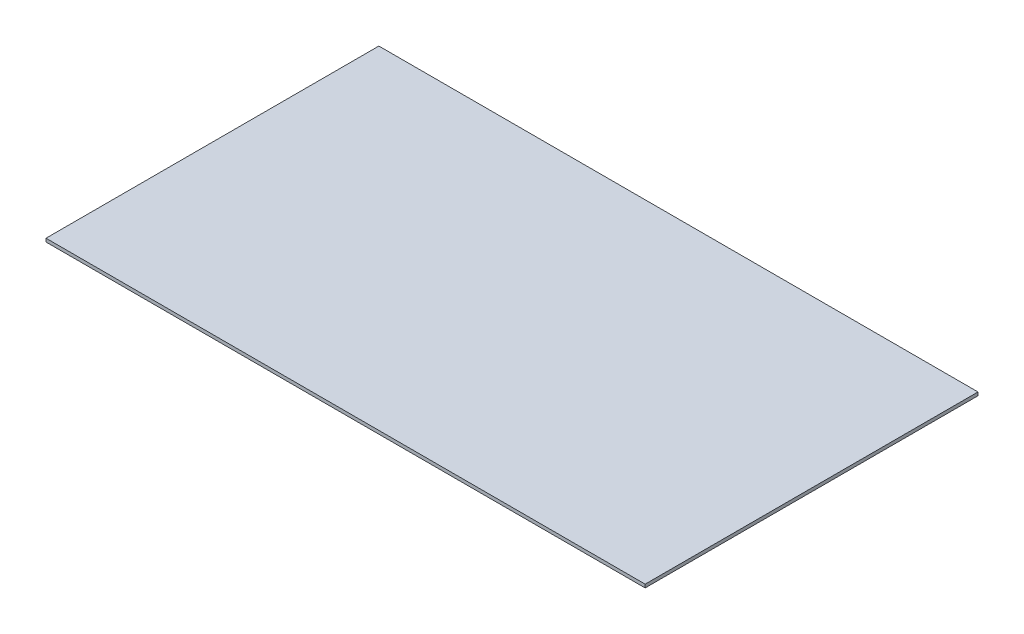
ISO-10303-21;
HEADER;
FILE_DESCRIPTION(('STEP AP214'),'2;1');
FILE_NAME('part.step','',(''),(''),'','','');
FILE_SCHEMA(('AUTOMOTIVE_DESIGN { 1 0 10303 214 1 1 1 1 }'));
ENDSEC;
DATA;
#1=APPLICATION_CONTEXT('core data for automotive mechanical design processes');
#2=APPLICATION_PROTOCOL_DEFINITION('international standard','automotive_design',2000,#1);
#3=PRODUCT_CONTEXT('',#1,'mechanical');
#4=PRODUCT('Part','Part','',(#3));
#5=PRODUCT_RELATED_PRODUCT_CATEGORY('part','',(#4));
#6=PRODUCT_DEFINITION_FORMATION('','',#4);
#7=PRODUCT_DEFINITION_CONTEXT('part definition',#1,'design');
#8=PRODUCT_DEFINITION('design','',#6,#7);
#9=PRODUCT_DEFINITION_SHAPE('','',#8);
#10=(LENGTH_UNIT() NAMED_UNIT(*) SI_UNIT(.MILLI.,.METRE.));
#11=(NAMED_UNIT(*) PLANE_ANGLE_UNIT() SI_UNIT($,.RADIAN.));
#12=(NAMED_UNIT(*) SI_UNIT($,.STERADIAN.) SOLID_ANGLE_UNIT());
#13=UNCERTAINTY_MEASURE_WITH_UNIT(LENGTH_MEASURE(1.E-05),#10,'distance_accuracy_value','');
#14=(GEOMETRIC_REPRESENTATION_CONTEXT(3) GLOBAL_UNCERTAINTY_ASSIGNED_CONTEXT((#13)) GLOBAL_UNIT_ASSIGNED_CONTEXT((#10,
#11,#12)) REPRESENTATION_CONTEXT('',''));
#15=CARTESIAN_POINT('',(0.,0.,0.));
#16=DIRECTION('',(0.,0.,1.));
#17=DIRECTION('',(1.,0.,0.));
#18=AXIS2_PLACEMENT_3D('',#15,#16,#17);
#19=CARTESIAN_POINT('',(-18.,10.,0.));
#20=DIRECTION('',(-1.,0.,0.));
#21=DIRECTION('',(0.,0.,-1.));
#22=AXIS2_PLACEMENT_3D('',#19,#20,#21);
#23=PLANE('',#22);
#24=DIRECTION('',(0.,1.,0.));
#25=VECTOR('',#24,1.);
#26=CARTESIAN_POINT('',(-18.,10.,27.));
#27=LINE('',#26,#25);
#28=CARTESIAN_POINT('',(-18.,10.,27.));
#29=VERTEX_POINT('',#28);
#30=CARTESIAN_POINT('',(-18.,10.2,27.));
#31=VERTEX_POINT('',#30);
#32=EDGE_CURVE('E11',#29,#31,#27,.T.);
#33=ORIENTED_EDGE('',*,*,#32,.F.);
#34=DIRECTION('',(0.,0.,-1.));
#35=VECTOR('',#34,1.);
#36=CARTESIAN_POINT('',(-18.,10.,0.));
#37=LINE('',#36,#35);
#38=CARTESIAN_POINT('',(-18.,10.,47.));
#39=VERTEX_POINT('',#38);
#40=EDGE_CURVE('E88',#29,#39,#37,.F.);
#41=ORIENTED_EDGE('',*,*,#40,.T.);
#42=DIRECTION('',(0.,1.,0.));
#43=VECTOR('',#42,1.);
#44=CARTESIAN_POINT('',(-18.,10.,47.));
#45=LINE('',#44,#43);
#46=CARTESIAN_POINT('',(-18.,10.2,47.));
#47=VERTEX_POINT('',#46);
#48=EDGE_CURVE('E43',#39,#47,#45,.T.);
#49=ORIENTED_EDGE('',*,*,#48,.T.);
#50=DIRECTION('',(0.,0.,-1.));
#51=VECTOR('',#50,1.);
#52=CARTESIAN_POINT('',(-18.,10.2,0.));
#53=LINE('',#52,#51);
#54=EDGE_CURVE('E101',#31,#47,#53,.F.);
#55=ORIENTED_EDGE('',*,*,#54,.F.);
#56=EDGE_LOOP('',(#33,#41,#49,#55));
#57=FACE_BOUND('',#56,.T.);
#58=ADVANCED_FACE('F33',(#57),#23,.T.);
#59=CARTESIAN_POINT('',(0.,10.,47.));
#60=DIRECTION('',(0.,0.,-1.));
#61=DIRECTION('',(1.,0.,0.));
#62=AXIS2_PLACEMENT_3D('',#59,#60,#61);
#63=PLANE('',#62);
#64=ORIENTED_EDGE('',*,*,#48,.F.);
#65=DIRECTION('',(1.,0.,0.));
#66=VECTOR('',#65,1.);
#67=CARTESIAN_POINT('',(0.,10.,47.));
#68=LINE('',#67,#66);
#69=CARTESIAN_POINT('',(18.,10.,47.));
#70=VERTEX_POINT('',#69);
#71=EDGE_CURVE('E95',#39,#70,#68,.T.);
#72=ORIENTED_EDGE('',*,*,#71,.T.);
#73=DIRECTION('',(0.,1.,0.));
#74=VECTOR('',#73,1.);
#75=CARTESIAN_POINT('',(18.,10.,47.));
#76=LINE('',#75,#74);
#77=CARTESIAN_POINT('',(18.,10.2,47.));
#78=VERTEX_POINT('',#77);
#79=EDGE_CURVE('E51',#70,#78,#76,.T.);
#80=ORIENTED_EDGE('',*,*,#79,.T.);
#81=DIRECTION('',(1.,0.,0.));
#82=VECTOR('',#81,1.);
#83=CARTESIAN_POINT('',(0.,10.2,47.));
#84=LINE('',#83,#82);
#85=EDGE_CURVE('E82',#47,#78,#84,.T.);
#86=ORIENTED_EDGE('',*,*,#85,.F.);
#87=EDGE_LOOP('',(#64,#72,#80,#86));
#88=FACE_BOUND('',#87,.T.);
#89=ADVANCED_FACE('F105',(#88),#63,.F.);
#90=CARTESIAN_POINT('',(18.,10.,0.));
#91=DIRECTION('',(-1.,0.,0.));
#92=DIRECTION('',(0.,0.,-1.));
#93=AXIS2_PLACEMENT_3D('',#90,#91,#92);
#94=PLANE('',#93);
#95=ORIENTED_EDGE('',*,*,#79,.F.);
#96=DIRECTION('',(0.,0.,-1.));
#97=VECTOR('',#96,1.);
#98=CARTESIAN_POINT('',(18.,10.,0.));
#99=LINE('',#98,#97);
#100=CARTESIAN_POINT('',(18.,10.,27.));
#101=VERTEX_POINT('',#100);
#102=EDGE_CURVE('E87',#101,#70,#99,.F.);
#103=ORIENTED_EDGE('',*,*,#102,.F.);
#104=DIRECTION('',(0.,1.,0.));
#105=VECTOR('',#104,1.);
#106=CARTESIAN_POINT('',(18.,10.,27.));
#107=LINE('',#106,#105);
#108=CARTESIAN_POINT('',(18.,10.2,27.));
#109=VERTEX_POINT('',#108);
#110=EDGE_CURVE('E37',#101,#109,#107,.T.);
#111=ORIENTED_EDGE('',*,*,#110,.T.);
#112=DIRECTION('',(0.,0.,-1.));
#113=VECTOR('',#112,1.);
#114=CARTESIAN_POINT('',(18.,10.2,0.));
#115=LINE('',#114,#113);
#116=EDGE_CURVE('E97',#109,#78,#115,.F.);
#117=ORIENTED_EDGE('',*,*,#116,.T.);
#118=EDGE_LOOP('',(#95,#103,#111,#117));
#119=FACE_BOUND('',#118,.T.);
#120=ADVANCED_FACE('F90',(#119),#94,.F.);
#121=CARTESIAN_POINT('',(0.,10.,27.));
#122=DIRECTION('',(0.,0.,-1.));
#123=DIRECTION('',(1.,0.,0.));
#124=AXIS2_PLACEMENT_3D('',#121,#122,#123);
#125=PLANE('',#124);
#126=DIRECTION('',(1.,0.,0.));
#127=VECTOR('',#126,1.);
#128=CARTESIAN_POINT('',(0.,10.,27.));
#129=LINE('',#128,#127);
#130=EDGE_CURVE('E76',#101,#29,#129,.F.);
#131=ORIENTED_EDGE('',*,*,#130,.T.);
#132=ORIENTED_EDGE('',*,*,#32,.T.);
#133=DIRECTION('',(1.,0.,0.));
#134=VECTOR('',#133,1.);
#135=CARTESIAN_POINT('',(0.,10.2,27.));
#136=LINE('',#135,#134);
#137=EDGE_CURVE('E78',#109,#31,#136,.F.);
#138=ORIENTED_EDGE('',*,*,#137,.F.);
#139=ORIENTED_EDGE('',*,*,#110,.F.);
#140=EDGE_LOOP('',(#131,#132,#138,#139));
#141=FACE_BOUND('',#140,.T.);
#142=ADVANCED_FACE('F35',(#141),#125,.T.);
#143=CARTESIAN_POINT('',(0.,10.2,0.));
#144=DIRECTION('',(0.,-1.,0.));
#145=DIRECTION('',(0.,0.,-1.));
#146=AXIS2_PLACEMENT_3D('',#143,#144,#145);
#147=PLANE('',#146);
#148=ORIENTED_EDGE('',*,*,#116,.F.);
#149=ORIENTED_EDGE('',*,*,#137,.T.);
#150=ORIENTED_EDGE('',*,*,#54,.T.);
#151=ORIENTED_EDGE('',*,*,#85,.T.);
#152=EDGE_LOOP('',(#148,#149,#150,#151));
#153=FACE_BOUND('',#152,.T.);
#154=ADVANCED_FACE('F104',(#153),#147,.F.);
#155=CARTESIAN_POINT('',(0.,10.,0.));
#156=DIRECTION('',(0.,-1.,0.));
#157=DIRECTION('',(0.,0.,-1.));
#158=AXIS2_PLACEMENT_3D('',#155,#156,#157);
#159=PLANE('',#158);
#160=ORIENTED_EDGE('',*,*,#102,.T.);
#161=ORIENTED_EDGE('',*,*,#71,.F.);
#162=ORIENTED_EDGE('',*,*,#40,.F.);
#163=ORIENTED_EDGE('',*,*,#130,.F.);
#164=EDGE_LOOP('',(#160,#161,#162,#163));
#165=FACE_BOUND('',#164,.T.);
#166=ADVANCED_FACE('F85',(#165),#159,.T.);
#167=CLOSED_SHELL('',(#58,#89,#120,#142,#154,#166));
#168=MANIFOLD_SOLID_BREP('B2',#167);
#169=ADVANCED_BREP_SHAPE_REPRESENTATION('',(#18,#168),#14);
#170=SHAPE_DEFINITION_REPRESENTATION(#9,#169);
ENDSEC;
END-ISO-10303-21;
